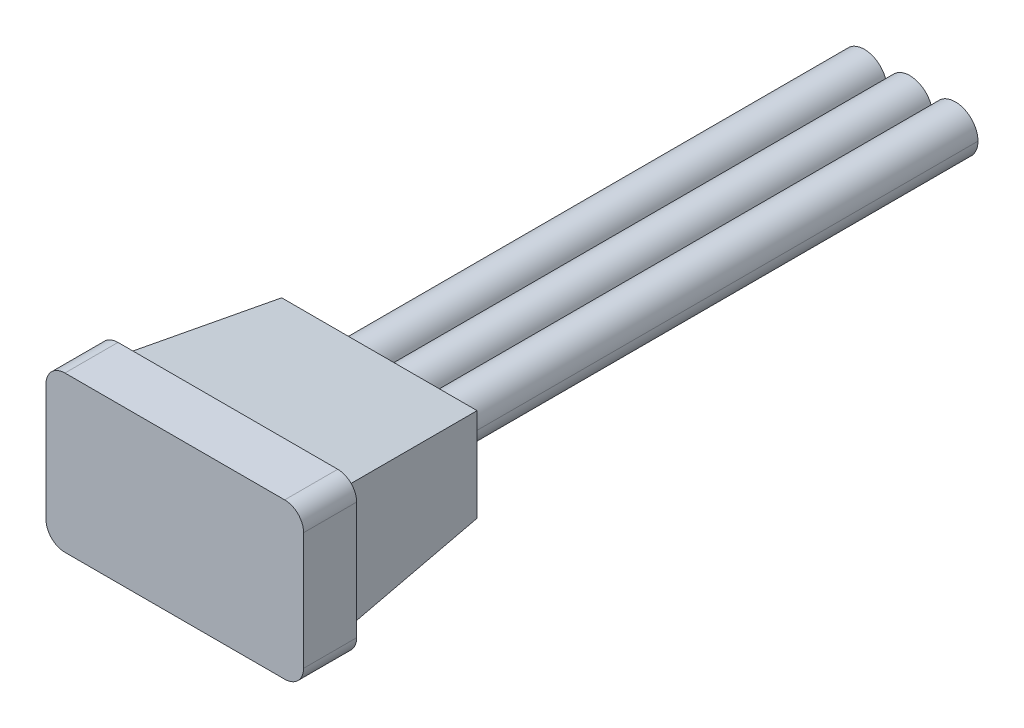
ISO-10303-21;
HEADER;
FILE_DESCRIPTION(('STEP AP214'),'2;1');
FILE_NAME('part.step','',(''),(''),'','','');
FILE_SCHEMA(('AUTOMOTIVE_DESIGN { 1 0 10303 214 1 1 1 1 }'));
ENDSEC;
DATA;
#1=APPLICATION_CONTEXT('core data for automotive mechanical design processes');
#2=APPLICATION_PROTOCOL_DEFINITION('international standard','automotive_design',2000,#1);
#3=PRODUCT_CONTEXT('',#1,'mechanical');
#4=PRODUCT('Part','Part','',(#3));
#5=PRODUCT_RELATED_PRODUCT_CATEGORY('part','',(#4));
#6=PRODUCT_DEFINITION_FORMATION('','',#4);
#7=PRODUCT_DEFINITION_CONTEXT('part definition',#1,'design');
#8=PRODUCT_DEFINITION('design','',#6,#7);
#9=PRODUCT_DEFINITION_SHAPE('','',#8);
#10=(LENGTH_UNIT() NAMED_UNIT(*) SI_UNIT(.MILLI.,.METRE.));
#11=(NAMED_UNIT(*) PLANE_ANGLE_UNIT() SI_UNIT($,.RADIAN.));
#12=(NAMED_UNIT(*) SI_UNIT($,.STERADIAN.) SOLID_ANGLE_UNIT());
#13=UNCERTAINTY_MEASURE_WITH_UNIT(LENGTH_MEASURE(1.E-05),#10,'distance_accuracy_value','');
#14=(GEOMETRIC_REPRESENTATION_CONTEXT(3) GLOBAL_UNCERTAINTY_ASSIGNED_CONTEXT((#13)) GLOBAL_UNIT_ASSIGNED_CONTEXT((#10,
#11,#12)) REPRESENTATION_CONTEXT('',''));
#15=CARTESIAN_POINT('',(0.,0.,0.));
#16=DIRECTION('',(0.,0.,1.));
#17=DIRECTION('',(1.,0.,0.));
#18=AXIS2_PLACEMENT_3D('',#15,#16,#17);
#19=CARTESIAN_POINT('',(2.9,1.55,-1.4));
#20=DIRECTION('',(0.,0.,1.));
#21=DIRECTION('',(1.,0.,0.));
#22=AXIS2_PLACEMENT_3D('',#19,#20,#21);
#23=CYLINDRICAL_SURFACE('',#22,0.5);
#24=CARTESIAN_POINT('',(2.9,1.55,-1.4));
#25=DIRECTION('',(0.,0.,-1.));
#26=DIRECTION('',(1.,0.,0.));
#27=AXIS2_PLACEMENT_3D('',#24,#25,#26);
#28=CIRCLE('',#27,0.5);
#29=CARTESIAN_POINT('',(2.9,2.05,-1.4));
#30=VERTEX_POINT('',#29);
#31=CARTESIAN_POINT('',(3.4,1.55,-1.4));
#32=VERTEX_POINT('',#31);
#33=EDGE_CURVE('P0_E146',#30,#32,#28,.T.);
#34=ORIENTED_EDGE('',*,*,#33,.F.);
#35=DIRECTION('',(0.,0.,-1.));
#36=VECTOR('',#35,1.);
#37=CARTESIAN_POINT('',(2.9,2.05,-1.4));
#38=LINE('',#37,#36);
#39=CARTESIAN_POINT('',(2.9,2.05,0.));
#40=VERTEX_POINT('',#39);
#41=EDGE_CURVE('P0_E252',#40,#30,#38,.T.);
#42=ORIENTED_EDGE('',*,*,#41,.F.);
#43=CARTESIAN_POINT('',(2.9,1.55,0.));
#44=DIRECTION('',(0.,0.,1.));
#45=DIRECTION('',(1.,0.,0.));
#46=AXIS2_PLACEMENT_3D('',#43,#44,#45);
#47=CIRCLE('',#46,0.5);
#48=CARTESIAN_POINT('',(3.4,1.55,0.));
#49=VERTEX_POINT('',#48);
#50=EDGE_CURVE('P0_E183',#49,#40,#47,.T.);
#51=ORIENTED_EDGE('',*,*,#50,.F.);
#52=DIRECTION('',(0.,0.,1.));
#53=VECTOR('',#52,1.);
#54=CARTESIAN_POINT('',(3.4,1.55,-1.4));
#55=LINE('',#54,#53);
#56=EDGE_CURVE('P0_E131',#32,#49,#55,.T.);
#57=ORIENTED_EDGE('',*,*,#56,.F.);
#58=EDGE_LOOP('',(#34,#42,#51,#57));
#59=FACE_BOUND('',#58,.T.);
#60=ADVANCED_FACE('P0_F16',(#59),#23,.T.);
#61=CARTESIAN_POINT('',(2.9,-1.55,-1.4));
#62=DIRECTION('',(0.,0.,1.));
#63=DIRECTION('',(1.,0.,0.));
#64=AXIS2_PLACEMENT_3D('',#61,#62,#63);
#65=CYLINDRICAL_SURFACE('',#64,0.5);
#66=CARTESIAN_POINT('',(2.9,-1.55,-1.4));
#67=DIRECTION('',(0.,0.,-1.));
#68=DIRECTION('',(1.,0.,0.));
#69=AXIS2_PLACEMENT_3D('',#66,#67,#68);
#70=CIRCLE('',#69,0.5);
#71=CARTESIAN_POINT('',(3.4,-1.55,-1.4));
#72=VERTEX_POINT('',#71);
#73=CARTESIAN_POINT('',(2.9,-2.05,-1.4));
#74=VERTEX_POINT('',#73);
#75=EDGE_CURVE('P0_E134',#72,#74,#70,.T.);
#76=ORIENTED_EDGE('',*,*,#75,.F.);
#77=DIRECTION('',(0.,0.,-1.));
#78=VECTOR('',#77,1.);
#79=CARTESIAN_POINT('',(3.4,-1.55,-1.4));
#80=LINE('',#79,#78);
#81=CARTESIAN_POINT('',(3.4,-1.55,0.));
#82=VERTEX_POINT('',#81);
#83=EDGE_CURVE('P0_E119',#82,#72,#80,.T.);
#84=ORIENTED_EDGE('',*,*,#83,.F.);
#85=CARTESIAN_POINT('',(2.9,-1.55,0.));
#86=DIRECTION('',(0.,0.,1.));
#87=DIRECTION('',(1.,0.,0.));
#88=AXIS2_PLACEMENT_3D('',#85,#86,#87);
#89=CIRCLE('',#88,0.5);
#90=CARTESIAN_POINT('',(2.9,-2.05,0.));
#91=VERTEX_POINT('',#90);
#92=EDGE_CURVE('P0_E180',#91,#82,#89,.T.);
#93=ORIENTED_EDGE('',*,*,#92,.F.);
#94=DIRECTION('',(0.,0.,1.));
#95=VECTOR('',#94,1.);
#96=CARTESIAN_POINT('',(2.9,-2.05,-1.4));
#97=LINE('',#96,#95);
#98=EDGE_CURVE('P0_E136',#74,#91,#97,.T.);
#99=ORIENTED_EDGE('',*,*,#98,.F.);
#100=EDGE_LOOP('',(#76,#84,#93,#99));
#101=FACE_BOUND('',#100,.T.);
#102=ADVANCED_FACE('P0_F18',(#101),#65,.T.);
#103=CARTESIAN_POINT('',(-2.9,1.55,-1.4));
#104=DIRECTION('',(0.,0.,1.));
#105=DIRECTION('',(1.,0.,0.));
#106=AXIS2_PLACEMENT_3D('',#103,#104,#105);
#107=CYLINDRICAL_SURFACE('',#106,0.5);
#108=CARTESIAN_POINT('',(-2.9,1.55,-1.4));
#109=DIRECTION('',(0.,0.,-1.));
#110=DIRECTION('',(1.,0.,0.));
#111=AXIS2_PLACEMENT_3D('',#108,#109,#110);
#112=CIRCLE('',#111,0.5);
#113=CARTESIAN_POINT('',(-3.4,1.55,-1.4));
#114=VERTEX_POINT('',#113);
#115=CARTESIAN_POINT('',(-2.9,2.05,-1.4));
#116=VERTEX_POINT('',#115);
#117=EDGE_CURVE('P0_E169',#114,#116,#112,.T.);
#118=ORIENTED_EDGE('',*,*,#117,.F.);
#119=DIRECTION('',(0.,0.,-1.));
#120=VECTOR('',#119,1.);
#121=CARTESIAN_POINT('',(-3.4,1.55,-1.4));
#122=LINE('',#121,#120);
#123=CARTESIAN_POINT('',(-3.4,1.55,0.));
#124=VERTEX_POINT('',#123);
#125=EDGE_CURVE('P0_E219',#124,#114,#122,.T.);
#126=ORIENTED_EDGE('',*,*,#125,.F.);
#127=CARTESIAN_POINT('',(-2.9,1.55,0.));
#128=DIRECTION('',(0.,0.,1.));
#129=DIRECTION('',(1.,0.,0.));
#130=AXIS2_PLACEMENT_3D('',#127,#128,#129);
#131=CIRCLE('',#130,0.5);
#132=CARTESIAN_POINT('',(-2.9,2.05,0.));
#133=VERTEX_POINT('',#132);
#134=EDGE_CURVE('P0_E194',#133,#124,#131,.T.);
#135=ORIENTED_EDGE('',*,*,#134,.F.);
#136=DIRECTION('',(0.,0.,1.));
#137=VECTOR('',#136,1.);
#138=CARTESIAN_POINT('',(-2.9,2.05,-1.4));
#139=LINE('',#138,#137);
#140=EDGE_CURVE('P0_E230',#116,#133,#139,.T.);
#141=ORIENTED_EDGE('',*,*,#140,.F.);
#142=EDGE_LOOP('',(#118,#126,#135,#141));
#143=FACE_BOUND('',#142,.T.);
#144=ADVANCED_FACE('P0_F380',(#143),#107,.T.);
#145=CARTESIAN_POINT('',(-2.9,-1.55,-1.4));
#146=DIRECTION('',(0.,0.,1.));
#147=DIRECTION('',(1.,0.,0.));
#148=AXIS2_PLACEMENT_3D('',#145,#146,#147);
#149=CYLINDRICAL_SURFACE('',#148,0.5);
#150=CARTESIAN_POINT('',(-2.9,-1.55,-1.4));
#151=DIRECTION('',(0.,0.,-1.));
#152=DIRECTION('',(1.,0.,0.));
#153=AXIS2_PLACEMENT_3D('',#150,#151,#152);
#154=CIRCLE('',#153,0.5);
#155=CARTESIAN_POINT('',(-2.9,-2.05,-1.4));
#156=VERTEX_POINT('',#155);
#157=CARTESIAN_POINT('',(-3.4,-1.55,-1.4));
#158=VERTEX_POINT('',#157);
#159=EDGE_CURVE('P0_E226',#156,#158,#154,.T.);
#160=ORIENTED_EDGE('',*,*,#159,.F.);
#161=DIRECTION('',(0.,0.,-1.));
#162=VECTOR('',#161,1.);
#163=CARTESIAN_POINT('',(-2.9,-2.05,-1.4));
#164=LINE('',#163,#162);
#165=CARTESIAN_POINT('',(-2.9,-2.05,0.));
#166=VERTEX_POINT('',#165);
#167=EDGE_CURVE('P0_E156',#166,#156,#164,.T.);
#168=ORIENTED_EDGE('',*,*,#167,.F.);
#169=CARTESIAN_POINT('',(-2.9,-1.55,0.));
#170=DIRECTION('',(0.,0.,1.));
#171=DIRECTION('',(1.,0.,0.));
#172=AXIS2_PLACEMENT_3D('',#169,#170,#171);
#173=CIRCLE('',#172,0.5);
#174=CARTESIAN_POINT('',(-3.4,-1.55,0.));
#175=VERTEX_POINT('',#174);
#176=EDGE_CURVE('P0_E184',#175,#166,#173,.T.);
#177=ORIENTED_EDGE('',*,*,#176,.F.);
#178=DIRECTION('',(0.,0.,1.));
#179=VECTOR('',#178,1.);
#180=CARTESIAN_POINT('',(-3.4,-1.55,-1.4));
#181=LINE('',#180,#179);
#182=EDGE_CURVE('P0_E229',#158,#175,#181,.T.);
#183=ORIENTED_EDGE('',*,*,#182,.F.);
#184=EDGE_LOOP('',(#160,#168,#177,#183));
#185=FACE_BOUND('',#184,.T.);
#186=ADVANCED_FACE('P0_F303',(#185),#149,.T.);
#187=CARTESIAN_POINT('',(0.,0.,-5.4));
#188=DIRECTION('',(0.,0.,1.));
#189=DIRECTION('',(1.,0.,0.));
#190=AXIS2_PLACEMENT_3D('',#187,#188,#189);
#191=PLANE('',#190);
#192=DIRECTION('',(0.,-1.,0.));
#193=VECTOR('',#192,1.);
#194=CARTESIAN_POINT('',(2.5795830589373,0.,-5.4));
#195=LINE('',#194,#193);
#196=CARTESIAN_POINT('',(2.5795830589373,1.22958305893729,-5.4));
#197=VERTEX_POINT('',#196);
#198=CARTESIAN_POINT('',(2.5795830589373,-1.22958305893729,-5.4));
#199=VERTEX_POINT('',#198);
#200=EDGE_CURVE('P0_E193',#197,#199,#195,.T.);
#201=ORIENTED_EDGE('',*,*,#200,.T.);
#202=DIRECTION('',(-1.,0.,0.));
#203=VECTOR('',#202,1.);
#204=CARTESIAN_POINT('',(0.,-1.22958305893729,-5.4));
#205=LINE('',#204,#203);
#206=CARTESIAN_POINT('',(-2.5795830589373,-1.22958305893729,-5.4));
#207=VERTEX_POINT('',#206);
#208=EDGE_CURVE('P0_E162',#199,#207,#205,.T.);
#209=ORIENTED_EDGE('',*,*,#208,.T.);
#210=DIRECTION('',(0.,1.,0.));
#211=VECTOR('',#210,1.);
#212=CARTESIAN_POINT('',(-2.5795830589373,0.,-5.4));
#213=LINE('',#212,#211);
#214=CARTESIAN_POINT('',(-2.5795830589373,1.22958305893729,-5.4));
#215=VERTEX_POINT('',#214);
#216=EDGE_CURVE('P0_E27',#207,#215,#213,.T.);
#217=ORIENTED_EDGE('',*,*,#216,.T.);
#218=DIRECTION('',(1.,0.,0.));
#219=VECTOR('',#218,1.);
#220=CARTESIAN_POINT('',(0.,1.22958305893729,-5.4));
#221=LINE('',#220,#219);
#222=EDGE_CURVE('P0_E11',#215,#197,#221,.T.);
#223=ORIENTED_EDGE('',*,*,#222,.T.);
#224=EDGE_LOOP('',(#201,#209,#217,#223));
#225=FACE_BOUND('',#224,.T.);
#226=ADVANCED_FACE('P0_F279',(#225),#191,.F.);
#227=CARTESIAN_POINT('',(-3.,1.65,-1.4));
#228=DIRECTION('',(0.,0.994521895368273,-0.104528463267654));
#229=DIRECTION('',(-1.,0.,0.));
#230=AXIS2_PLACEMENT_3D('',#227,#228,#229);
#231=PLANE('',#230);
#232=DIRECTION('',(1.,0.,0.));
#233=VECTOR('',#232,1.);
#234=CARTESIAN_POINT('',(-3.,1.65,-1.4));
#235=LINE('',#234,#233);
#236=CARTESIAN_POINT('',(-3.,1.65,-1.4));
#237=VERTEX_POINT('',#236);
#238=CARTESIAN_POINT('',(3.,1.65,-1.4));
#239=VERTEX_POINT('',#238);
#240=EDGE_CURVE('P0_E170',#237,#239,#235,.T.);
#241=ORIENTED_EDGE('',*,*,#240,.T.);
#242=DIRECTION('',(0.103962051184498,0.103962051184498,0.989132844377854));
#243=VECTOR('',#242,1.);
#244=CARTESIAN_POINT('',(3.,1.65,-1.4));
#245=LINE('',#244,#243);
#246=EDGE_CURVE('P0_E179',#197,#239,#245,.T.);
#247=ORIENTED_EDGE('',*,*,#246,.F.);
#248=ORIENTED_EDGE('',*,*,#222,.F.);
#249=DIRECTION('',(-0.103962051184498,0.103962051184498,0.989132844377854));
#250=VECTOR('',#249,1.);
#251=CARTESIAN_POINT('',(-3.,1.65,-1.4));
#252=LINE('',#251,#250);
#253=EDGE_CURVE('P0_E159',#215,#237,#252,.T.);
#254=ORIENTED_EDGE('',*,*,#253,.T.);
#255=EDGE_LOOP('',(#241,#247,#248,#254));
#256=FACE_BOUND('',#255,.T.);
#257=ADVANCED_FACE('P0_F375',(#256),#231,.T.);
#258=CARTESIAN_POINT('',(-3.,1.65,-1.4));
#259=DIRECTION('',(-0.994521895368273,0.,-0.104528463267654));
#260=DIRECTION('',(-0.104528463267654,0.,0.994521895368273));
#261=AXIS2_PLACEMENT_3D('',#258,#259,#260);
#262=PLANE('',#261);
#263=DIRECTION('',(0.,1.,0.));
#264=VECTOR('',#263,1.);
#265=CARTESIAN_POINT('',(-3.,1.65,-1.4));
#266=LINE('',#265,#264);
#267=CARTESIAN_POINT('',(-3.,-1.65,-1.4));
#268=VERTEX_POINT('',#267);
#269=EDGE_CURVE('P0_E174',#268,#237,#266,.T.);
#270=ORIENTED_EDGE('',*,*,#269,.T.);
#271=ORIENTED_EDGE('',*,*,#253,.F.);
#272=ORIENTED_EDGE('',*,*,#216,.F.);
#273=DIRECTION('',(-0.103962051184498,-0.103962051184498,0.989132844377854));
#274=VECTOR('',#273,1.);
#275=CARTESIAN_POINT('',(-2.96433324331459,-1.61433324331459,-1.73934652200508));
#276=LINE('',#275,#274);
#277=EDGE_CURVE('P0_E175',#207,#268,#276,.T.);
#278=ORIENTED_EDGE('',*,*,#277,.T.);
#279=EDGE_LOOP('',(#270,#271,#272,#278));
#280=FACE_BOUND('',#279,.T.);
#281=ADVANCED_FACE('P0_F278',(#280),#262,.T.);
#282=CARTESIAN_POINT('',(-3.,-1.65,-1.4));
#283=DIRECTION('',(0.,-0.994521895368273,-0.104528463267654));
#284=DIRECTION('',(0.,0.104528463267654,-0.994521895368273));
#285=AXIS2_PLACEMENT_3D('',#282,#283,#284);
#286=PLANE('',#285);
#287=DIRECTION('',(-1.,0.,0.));
#288=VECTOR('',#287,1.);
#289=CARTESIAN_POINT('',(-3.,-1.65,-1.4));
#290=LINE('',#289,#288);
#291=CARTESIAN_POINT('',(3.,-1.65,-1.4));
#292=VERTEX_POINT('',#291);
#293=EDGE_CURVE('P0_E248',#292,#268,#290,.T.);
#294=ORIENTED_EDGE('',*,*,#293,.T.);
#295=ORIENTED_EDGE('',*,*,#277,.F.);
#296=ORIENTED_EDGE('',*,*,#208,.F.);
#297=DIRECTION('',(0.103962051184498,-0.103962051184498,0.989132844377854));
#298=VECTOR('',#297,1.);
#299=CARTESIAN_POINT('',(2.93515135148107,-1.58515135148107,-2.01699367637287));
#300=LINE('',#299,#298);
#301=EDGE_CURVE('P0_E190',#199,#292,#300,.T.);
#302=ORIENTED_EDGE('',*,*,#301,.T.);
#303=EDGE_LOOP('',(#294,#295,#296,#302));
#304=FACE_BOUND('',#303,.T.);
#305=ADVANCED_FACE('P0_F271',(#304),#286,.T.);
#306=CARTESIAN_POINT('',(3.,1.65,-1.4));
#307=DIRECTION('',(0.994521895368273,0.,-0.104528463267654));
#308=DIRECTION('',(0.,-1.,0.));
#309=AXIS2_PLACEMENT_3D('',#306,#307,#308);
#310=PLANE('',#309);
#311=DIRECTION('',(0.,-1.,0.));
#312=VECTOR('',#311,1.);
#313=CARTESIAN_POINT('',(3.,1.65,-1.4));
#314=LINE('',#313,#312);
#315=EDGE_CURVE('P0_E141',#239,#292,#314,.T.);
#316=ORIENTED_EDGE('',*,*,#315,.T.);
#317=ORIENTED_EDGE('',*,*,#301,.F.);
#318=ORIENTED_EDGE('',*,*,#200,.F.);
#319=ORIENTED_EDGE('',*,*,#246,.T.);
#320=EDGE_LOOP('',(#316,#317,#318,#319));
#321=FACE_BOUND('',#320,.T.);
#322=ADVANCED_FACE('P0_F367',(#321),#310,.T.);
#323=CARTESIAN_POINT('',(0.,0.,0.));
#324=DIRECTION('',(0.,0.,1.));
#325=DIRECTION('',(1.,0.,0.));
#326=AXIS2_PLACEMENT_3D('',#323,#324,#325);
#327=PLANE('',#326);
#328=DIRECTION('',(0.,-1.,0.));
#329=VECTOR('',#328,1.);
#330=CARTESIAN_POINT('',(-3.4,2.05,0.));
#331=LINE('',#330,#329);
#332=EDGE_CURVE('P0_E20',#124,#175,#331,.T.);
#333=ORIENTED_EDGE('',*,*,#332,.T.);
#334=ORIENTED_EDGE('',*,*,#176,.T.);
#335=DIRECTION('',(1.,0.,0.));
#336=VECTOR('',#335,1.);
#337=CARTESIAN_POINT('',(-3.4,-2.05,0.));
#338=LINE('',#337,#336);
#339=EDGE_CURVE('P0_E165',#166,#91,#338,.T.);
#340=ORIENTED_EDGE('',*,*,#339,.T.);
#341=ORIENTED_EDGE('',*,*,#92,.T.);
#342=DIRECTION('',(0.,1.,0.));
#343=VECTOR('',#342,1.);
#344=CARTESIAN_POINT('',(3.4,2.05,0.));
#345=LINE('',#344,#343);
#346=EDGE_CURVE('P0_E127',#82,#49,#345,.T.);
#347=ORIENTED_EDGE('',*,*,#346,.T.);
#348=ORIENTED_EDGE('',*,*,#50,.T.);
#349=DIRECTION('',(-1.,0.,0.));
#350=VECTOR('',#349,1.);
#351=CARTESIAN_POINT('',(-3.4,2.05,0.));
#352=LINE('',#351,#350);
#353=EDGE_CURVE('P0_E234',#40,#133,#352,.T.);
#354=ORIENTED_EDGE('',*,*,#353,.T.);
#355=ORIENTED_EDGE('',*,*,#134,.T.);
#356=EDGE_LOOP('',(#333,#334,#340,#341,#347,#348,#354,#355));
#357=FACE_BOUND('',#356,.T.);
#358=ADVANCED_FACE('P0_F298',(#357),#327,.T.);
#359=CARTESIAN_POINT('',(-3.4,2.05,-1.4));
#360=DIRECTION('',(0.,1.,0.));
#361=DIRECTION('',(1.,0.,0.));
#362=AXIS2_PLACEMENT_3D('',#359,#360,#361);
#363=PLANE('',#362);
#364=DIRECTION('',(-1.,0.,0.));
#365=VECTOR('',#364,1.);
#366=CARTESIAN_POINT('',(-3.4,2.05,-1.4));
#367=LINE('',#366,#365);
#368=EDGE_CURVE('P0_E153',#30,#116,#367,.T.);
#369=ORIENTED_EDGE('',*,*,#368,.T.);
#370=ORIENTED_EDGE('',*,*,#140,.T.);
#371=ORIENTED_EDGE('',*,*,#353,.F.);
#372=ORIENTED_EDGE('',*,*,#41,.T.);
#373=EDGE_LOOP('',(#369,#370,#371,#372));
#374=FACE_BOUND('',#373,.T.);
#375=ADVANCED_FACE('P0_F426',(#374),#363,.T.);
#376=CARTESIAN_POINT('',(-3.4,2.05,-1.4));
#377=DIRECTION('',(-1.,0.,0.));
#378=DIRECTION('',(0.,1.,0.));
#379=AXIS2_PLACEMENT_3D('',#376,#377,#378);
#380=PLANE('',#379);
#381=DIRECTION('',(0.,-1.,0.));
#382=VECTOR('',#381,1.);
#383=CARTESIAN_POINT('',(-3.4,2.05,-1.4));
#384=LINE('',#383,#382);
#385=EDGE_CURVE('P0_E198',#114,#158,#384,.T.);
#386=ORIENTED_EDGE('',*,*,#385,.T.);
#387=ORIENTED_EDGE('',*,*,#182,.T.);
#388=ORIENTED_EDGE('',*,*,#332,.F.);
#389=ORIENTED_EDGE('',*,*,#125,.T.);
#390=EDGE_LOOP('',(#386,#387,#388,#389));
#391=FACE_BOUND('',#390,.T.);
#392=ADVANCED_FACE('P0_F413',(#391),#380,.T.);
#393=CARTESIAN_POINT('',(-3.4,-2.05,-1.4));
#394=DIRECTION('',(0.,-1.,0.));
#395=DIRECTION('',(0.,0.,-1.));
#396=AXIS2_PLACEMENT_3D('',#393,#394,#395);
#397=PLANE('',#396);
#398=ORIENTED_EDGE('',*,*,#339,.F.);
#399=ORIENTED_EDGE('',*,*,#167,.T.);
#400=DIRECTION('',(1.,0.,0.));
#401=VECTOR('',#400,1.);
#402=CARTESIAN_POINT('',(-3.4,-2.05,-1.4));
#403=LINE('',#402,#401);
#404=EDGE_CURVE('P0_E238',#156,#74,#403,.T.);
#405=ORIENTED_EDGE('',*,*,#404,.T.);
#406=ORIENTED_EDGE('',*,*,#98,.T.);
#407=EDGE_LOOP('',(#398,#399,#405,#406));
#408=FACE_BOUND('',#407,.T.);
#409=ADVANCED_FACE('P0_F296',(#408),#397,.T.);
#410=CARTESIAN_POINT('',(3.4,2.05,-1.4));
#411=DIRECTION('',(1.,0.,0.));
#412=DIRECTION('',(0.,1.,0.));
#413=AXIS2_PLACEMENT_3D('',#410,#411,#412);
#414=PLANE('',#413);
#415=ORIENTED_EDGE('',*,*,#346,.F.);
#416=ORIENTED_EDGE('',*,*,#83,.T.);
#417=DIRECTION('',(0.,1.,0.));
#418=VECTOR('',#417,1.);
#419=CARTESIAN_POINT('',(3.4,2.05,-1.4));
#420=LINE('',#419,#418);
#421=EDGE_CURVE('P0_E124',#72,#32,#420,.T.);
#422=ORIENTED_EDGE('',*,*,#421,.T.);
#423=ORIENTED_EDGE('',*,*,#56,.T.);
#424=EDGE_LOOP('',(#415,#416,#422,#423));
#425=FACE_BOUND('',#424,.T.);
#426=ADVANCED_FACE('P0_F121',(#425),#414,.T.);
#427=CARTESIAN_POINT('',(0.,0.,-1.4));
#428=DIRECTION('',(0.,0.,1.));
#429=DIRECTION('',(1.,0.,0.));
#430=AXIS2_PLACEMENT_3D('',#427,#428,#429);
#431=PLANE('',#430);
#432=ORIENTED_EDGE('',*,*,#315,.F.);
#433=ORIENTED_EDGE('',*,*,#240,.F.);
#434=ORIENTED_EDGE('',*,*,#269,.F.);
#435=ORIENTED_EDGE('',*,*,#293,.F.);
#436=EDGE_LOOP('',(#432,#433,#434,#435));
#437=FACE_BOUND('',#436,.T.);
#438=ORIENTED_EDGE('',*,*,#404,.F.);
#439=ORIENTED_EDGE('',*,*,#159,.T.);
#440=ORIENTED_EDGE('',*,*,#385,.F.);
#441=ORIENTED_EDGE('',*,*,#117,.T.);
#442=ORIENTED_EDGE('',*,*,#368,.F.);
#443=ORIENTED_EDGE('',*,*,#33,.T.);
#444=ORIENTED_EDGE('',*,*,#421,.F.);
#445=ORIENTED_EDGE('',*,*,#75,.T.);
#446=EDGE_LOOP('',(#438,#439,#440,#441,#442,#443,#444,#445));
#447=FACE_BOUND('',#446,.T.);
#448=ADVANCED_FACE('P0_F143',(#437,#447),#431,.F.);
#449=CLOSED_SHELL('',(#60,#102,#144,#186,#226,#257,#281,#305,#322,#358,#375,#392,#409,#426,#448));
#450=MANIFOLD_SOLID_BREP('P0_B1',#449);
#451=CARTESIAN_POINT('',(0.,0.,-5.4));
#452=DIRECTION('',(0.,0.,-1.));
#453=DIRECTION('',(0.,-1.,0.));
#454=AXIS2_PLACEMENT_3D('',#451,#452,#453);
#455=PLANE('',#454);
#456=CARTESIAN_POINT('',(0.,0.,-5.4));
#457=DIRECTION('',(0.,0.,-1.));
#458=DIRECTION('',(-1.,0.,0.));
#459=AXIS2_PLACEMENT_3D('',#456,#457,#458);
#460=CIRCLE('',#459,0.6);
#461=CARTESIAN_POINT('',(0.6,0.,-5.4));
#462=VERTEX_POINT('',#461);
#463=CARTESIAN_POINT('',(-0.6,0.,-5.4));
#464=VERTEX_POINT('',#463);
#465=EDGE_CURVE('P1_E11',#462,#464,#460,.T.);
#466=ORIENTED_EDGE('',*,*,#465,.F.);
#467=CARTESIAN_POINT('',(0.,0.,-5.4));
#468=DIRECTION('',(0.,0.,-1.));
#469=DIRECTION('',(-1.,0.,0.));
#470=AXIS2_PLACEMENT_3D('',#467,#468,#469);
#471=CIRCLE('',#470,0.6);
#472=EDGE_CURVE('P1_E65',#464,#462,#471,.T.);
#473=ORIENTED_EDGE('',*,*,#472,.F.);
#474=EDGE_LOOP('',(#466,#473));
#475=FACE_BOUND('',#474,.T.);
#476=ADVANCED_FACE('P1_F16',(#475),#455,.F.);
#477=CARTESIAN_POINT('',(0.,0.,-19.4));
#478=DIRECTION('',(0.,0.,-1.));
#479=DIRECTION('',(0.,-1.,0.));
#480=AXIS2_PLACEMENT_3D('',#477,#478,#479);
#481=PLANE('',#480);
#482=CARTESIAN_POINT('',(0.,0.,-19.4));
#483=DIRECTION('',(0.,0.,-1.));
#484=DIRECTION('',(-1.,0.,0.));
#485=AXIS2_PLACEMENT_3D('',#482,#483,#484);
#486=CIRCLE('',#485,0.6);
#487=CARTESIAN_POINT('',(0.6,0.,-19.4));
#488=VERTEX_POINT('',#487);
#489=CARTESIAN_POINT('',(-0.6,0.,-19.4));
#490=VERTEX_POINT('',#489);
#491=EDGE_CURVE('P1_E24',#488,#490,#486,.T.);
#492=ORIENTED_EDGE('',*,*,#491,.T.);
#493=CARTESIAN_POINT('',(0.,0.,-19.4));
#494=DIRECTION('',(0.,0.,-1.));
#495=DIRECTION('',(-1.,0.,0.));
#496=AXIS2_PLACEMENT_3D('',#493,#494,#495);
#497=CIRCLE('',#496,0.6);
#498=EDGE_CURVE('P1_E54',#490,#488,#497,.T.);
#499=ORIENTED_EDGE('',*,*,#498,.T.);
#500=EDGE_LOOP('',(#492,#499));
#501=FACE_BOUND('',#500,.T.);
#502=ADVANCED_FACE('P1_F52',(#501),#481,.T.);
#503=CARTESIAN_POINT('',(0.,0.,-19.4));
#504=DIRECTION('',(0.,0.,1.));
#505=DIRECTION('',(1.,0.,0.));
#506=AXIS2_PLACEMENT_3D('',#503,#504,#505);
#507=CYLINDRICAL_SURFACE('',#506,0.6);
#508=DIRECTION('',(0.,0.,1.));
#509=VECTOR('',#508,1.);
#510=CARTESIAN_POINT('',(-0.6,0.,-19.4));
#511=LINE('',#510,#509);
#512=EDGE_CURVE('P1_E60',#490,#464,#511,.T.);
#513=ORIENTED_EDGE('',*,*,#512,.F.);
#514=ORIENTED_EDGE('',*,*,#491,.F.);
#515=DIRECTION('',(0.,0.,1.));
#516=VECTOR('',#515,1.);
#517=CARTESIAN_POINT('',(0.6,0.,-19.4));
#518=LINE('',#517,#516);
#519=EDGE_CURVE('P1_E57',#488,#462,#518,.T.);
#520=ORIENTED_EDGE('',*,*,#519,.T.);
#521=ORIENTED_EDGE('',*,*,#465,.T.);
#522=EDGE_LOOP('',(#513,#514,#520,#521));
#523=FACE_BOUND('',#522,.T.);
#524=ADVANCED_FACE('P1_F61',(#523),#507,.T.);
#525=CARTESIAN_POINT('',(0.,0.,-19.4));
#526=DIRECTION('',(0.,0.,1.));
#527=DIRECTION('',(1.,0.,0.));
#528=AXIS2_PLACEMENT_3D('',#525,#526,#527);
#529=CYLINDRICAL_SURFACE('',#528,0.6);
#530=ORIENTED_EDGE('',*,*,#498,.F.);
#531=ORIENTED_EDGE('',*,*,#512,.T.);
#532=ORIENTED_EDGE('',*,*,#472,.T.);
#533=ORIENTED_EDGE('',*,*,#519,.F.);
#534=EDGE_LOOP('',(#530,#531,#532,#533));
#535=FACE_BOUND('',#534,.T.);
#536=ADVANCED_FACE('P1_F67',(#535),#529,.T.);
#537=CLOSED_SHELL('',(#476,#502,#524,#536));
#538=MANIFOLD_SOLID_BREP('P1_B1',#537);
#539=CARTESIAN_POINT('',(0.,0.,-19.4));
#540=DIRECTION('',(0.,0.,-1.));
#541=DIRECTION('',(0.,-1.,0.));
#542=AXIS2_PLACEMENT_3D('',#539,#540,#541);
#543=PLANE('',#542);
#544=CARTESIAN_POINT('',(-1.2,0.,-19.4));
#545=DIRECTION('',(0.,0.,-1.));
#546=DIRECTION('',(-1.,0.,0.));
#547=AXIS2_PLACEMENT_3D('',#544,#545,#546);
#548=CIRCLE('',#547,0.6);
#549=CARTESIAN_POINT('',(-0.6,0.,-19.4));
#550=VERTEX_POINT('',#549);
#551=CARTESIAN_POINT('',(-1.8,0.,-19.4));
#552=VERTEX_POINT('',#551);
#553=EDGE_CURVE('P2_E25',#550,#552,#548,.T.);
#554=ORIENTED_EDGE('',*,*,#553,.T.);
#555=CARTESIAN_POINT('',(-1.2,0.,-19.4));
#556=DIRECTION('',(0.,0.,-1.));
#557=DIRECTION('',(-1.,0.,0.));
#558=AXIS2_PLACEMENT_3D('',#555,#556,#557);
#559=CIRCLE('',#558,0.6);
#560=EDGE_CURVE('P2_E55',#552,#550,#559,.T.);
#561=ORIENTED_EDGE('',*,*,#560,.T.);
#562=EDGE_LOOP('',(#554,#561));
#563=FACE_BOUND('',#562,.T.);
#564=ADVANCED_FACE('P2_F16',(#563),#543,.T.);
#565=CARTESIAN_POINT('',(-1.2,0.,-5.4));
#566=DIRECTION('',(0.,0.,-1.));
#567=DIRECTION('',(0.,-1.,0.));
#568=AXIS2_PLACEMENT_3D('',#565,#566,#567);
#569=PLANE('',#568);
#570=CARTESIAN_POINT('',(-1.2,0.,-5.4));
#571=DIRECTION('',(0.,0.,-1.));
#572=DIRECTION('',(-1.,0.,0.));
#573=AXIS2_PLACEMENT_3D('',#570,#571,#572);
#574=CIRCLE('',#573,0.6);
#575=CARTESIAN_POINT('',(-0.6,0.,-5.4));
#576=VERTEX_POINT('',#575);
#577=CARTESIAN_POINT('',(-1.8,0.,-5.4));
#578=VERTEX_POINT('',#577);
#579=EDGE_CURVE('P2_E11',#576,#578,#574,.T.);
#580=ORIENTED_EDGE('',*,*,#579,.F.);
#581=CARTESIAN_POINT('',(-1.2,0.,-5.4));
#582=DIRECTION('',(0.,0.,-1.));
#583=DIRECTION('',(-1.,0.,0.));
#584=AXIS2_PLACEMENT_3D('',#581,#582,#583);
#585=CIRCLE('',#584,0.6);
#586=EDGE_CURVE('P2_E66',#578,#576,#585,.T.);
#587=ORIENTED_EDGE('',*,*,#586,.F.);
#588=EDGE_LOOP('',(#580,#587));
#589=FACE_BOUND('',#588,.T.);
#590=ADVANCED_FACE('P2_F101',(#589),#569,.F.);
#591=CARTESIAN_POINT('',(-1.2,0.,-21.0970562748477));
#592=DIRECTION('',(0.,0.,1.));
#593=DIRECTION('',(1.,0.,0.));
#594=AXIS2_PLACEMENT_3D('',#591,#592,#593);
#595=CYLINDRICAL_SURFACE('',#594,0.6);
#596=DIRECTION('',(0.,0.,1.));
#597=VECTOR('',#596,1.);
#598=CARTESIAN_POINT('',(-1.8,0.,-21.0970562748477));
#599=LINE('',#598,#597);
#600=EDGE_CURVE('P2_E61',#552,#578,#599,.T.);
#601=ORIENTED_EDGE('',*,*,#600,.F.);
#602=ORIENTED_EDGE('',*,*,#553,.F.);
#603=DIRECTION('',(0.,0.,1.));
#604=VECTOR('',#603,1.);
#605=CARTESIAN_POINT('',(-0.6,0.,-21.0970562748477));
#606=LINE('',#605,#604);
#607=EDGE_CURVE('P2_E58',#550,#576,#606,.T.);
#608=ORIENTED_EDGE('',*,*,#607,.T.);
#609=ORIENTED_EDGE('',*,*,#579,.T.);
#610=EDGE_LOOP('',(#601,#602,#608,#609));
#611=FACE_BOUND('',#610,.T.);
#612=ADVANCED_FACE('P2_F62',(#611),#595,.T.);
#613=CARTESIAN_POINT('',(-1.2,0.,-21.0970562748477));
#614=DIRECTION('',(0.,0.,1.));
#615=DIRECTION('',(1.,0.,0.));
#616=AXIS2_PLACEMENT_3D('',#613,#614,#615);
#617=CYLINDRICAL_SURFACE('',#616,0.6);
#618=ORIENTED_EDGE('',*,*,#560,.F.);
#619=ORIENTED_EDGE('',*,*,#600,.T.);
#620=ORIENTED_EDGE('',*,*,#586,.T.);
#621=ORIENTED_EDGE('',*,*,#607,.F.);
#622=EDGE_LOOP('',(#618,#619,#620,#621));
#623=FACE_BOUND('',#622,.T.);
#624=ADVANCED_FACE('P2_F18',(#623),#617,.T.);
#625=CLOSED_SHELL('',(#564,#590,#612,#624));
#626=MANIFOLD_SOLID_BREP('P2_B1',#625);
#627=CARTESIAN_POINT('',(0.,0.,-19.4));
#628=DIRECTION('',(0.,0.,-1.));
#629=DIRECTION('',(0.,-1.,0.));
#630=AXIS2_PLACEMENT_3D('',#627,#628,#629);
#631=PLANE('',#630);
#632=CARTESIAN_POINT('',(1.2,0.,-19.4));
#633=DIRECTION('',(0.,0.,-1.));
#634=DIRECTION('',(-1.,0.,0.));
#635=AXIS2_PLACEMENT_3D('',#632,#633,#634);
#636=CIRCLE('',#635,0.6);
#637=CARTESIAN_POINT('',(1.8,0.,-19.4));
#638=VERTEX_POINT('',#637);
#639=CARTESIAN_POINT('',(0.6,0.,-19.4));
#640=VERTEX_POINT('',#639);
#641=EDGE_CURVE('P3_E19',#638,#640,#636,.T.);
#642=ORIENTED_EDGE('',*,*,#641,.T.);
#643=CARTESIAN_POINT('',(1.2,0.,-19.4));
#644=DIRECTION('',(0.,0.,-1.));
#645=DIRECTION('',(-1.,0.,0.));
#646=AXIS2_PLACEMENT_3D('',#643,#644,#645);
#647=CIRCLE('',#646,0.6);
#648=EDGE_CURVE('P3_E64',#640,#638,#647,.T.);
#649=ORIENTED_EDGE('',*,*,#648,.T.);
#650=EDGE_LOOP('',(#642,#649));
#651=FACE_BOUND('',#650,.T.);
#652=ADVANCED_FACE('P3_F16',(#651),#631,.T.);
#653=CARTESIAN_POINT('',(1.2,0.,-5.4));
#654=DIRECTION('',(0.,0.,-1.));
#655=DIRECTION('',(0.,-1.,0.));
#656=AXIS2_PLACEMENT_3D('',#653,#654,#655);
#657=PLANE('',#656);
#658=CARTESIAN_POINT('',(1.2,0.,-5.4));
#659=DIRECTION('',(0.,0.,-1.));
#660=DIRECTION('',(-1.,0.,0.));
#661=AXIS2_PLACEMENT_3D('',#658,#659,#660);
#662=CIRCLE('',#661,0.6);
#663=CARTESIAN_POINT('',(1.8,0.,-5.4));
#664=VERTEX_POINT('',#663);
#665=CARTESIAN_POINT('',(0.6,0.,-5.4));
#666=VERTEX_POINT('',#665);
#667=EDGE_CURVE('P3_E11',#664,#666,#662,.T.);
#668=ORIENTED_EDGE('',*,*,#667,.F.);
#669=CARTESIAN_POINT('',(1.2,0.,-5.4));
#670=DIRECTION('',(0.,0.,-1.));
#671=DIRECTION('',(-1.,0.,0.));
#672=AXIS2_PLACEMENT_3D('',#669,#670,#671);
#673=CIRCLE('',#672,0.6);
#674=EDGE_CURVE('P3_E65',#666,#664,#673,.T.);
#675=ORIENTED_EDGE('',*,*,#674,.F.);
#676=EDGE_LOOP('',(#668,#675));
#677=FACE_BOUND('',#676,.T.);
#678=ADVANCED_FACE('P3_F106',(#677),#657,.F.);
#679=CARTESIAN_POINT('',(1.2,0.,-21.0970562748477));
#680=DIRECTION('',(0.,0.,1.));
#681=DIRECTION('',(1.,0.,0.));
#682=AXIS2_PLACEMENT_3D('',#679,#680,#681);
#683=CYLINDRICAL_SURFACE('',#682,0.6);
#684=DIRECTION('',(0.,0.,1.));
#685=VECTOR('',#684,1.);
#686=CARTESIAN_POINT('',(0.6,0.,-21.0970562748477));
#687=LINE('',#686,#685);
#688=EDGE_CURVE('P3_E59',#640,#666,#687,.T.);
#689=ORIENTED_EDGE('',*,*,#688,.F.);
#690=ORIENTED_EDGE('',*,*,#641,.F.);
#691=DIRECTION('',(0.,0.,1.));
#692=VECTOR('',#691,1.);
#693=CARTESIAN_POINT('',(1.8,0.,-21.0970562748477));
#694=LINE('',#693,#692);
#695=EDGE_CURVE('P3_E56',#638,#664,#694,.T.);
#696=ORIENTED_EDGE('',*,*,#695,.T.);
#697=ORIENTED_EDGE('',*,*,#667,.T.);
#698=EDGE_LOOP('',(#689,#690,#696,#697));
#699=FACE_BOUND('',#698,.T.);
#700=ADVANCED_FACE('P3_F55',(#699),#683,.T.);
#701=CARTESIAN_POINT('',(1.2,0.,-21.0970562748477));
#702=DIRECTION('',(0.,0.,1.));
#703=DIRECTION('',(1.,0.,0.));
#704=AXIS2_PLACEMENT_3D('',#701,#702,#703);
#705=CYLINDRICAL_SURFACE('',#704,0.6);
#706=ORIENTED_EDGE('',*,*,#648,.F.);
#707=ORIENTED_EDGE('',*,*,#688,.T.);
#708=ORIENTED_EDGE('',*,*,#674,.T.);
#709=ORIENTED_EDGE('',*,*,#695,.F.);
#710=EDGE_LOOP('',(#706,#707,#708,#709));
#711=FACE_BOUND('',#710,.T.);
#712=ADVANCED_FACE('P3_F63',(#711),#705,.T.);
#713=CLOSED_SHELL('',(#652,#678,#700,#712));
#714=MANIFOLD_SOLID_BREP('P3_B1',#713);
#715=ADVANCED_BREP_SHAPE_REPRESENTATION('',(#18,#450,#538,#626,#714),#14);
#716=SHAPE_DEFINITION_REPRESENTATION(#9,#715);
ENDSEC;
END-ISO-10303-21;
